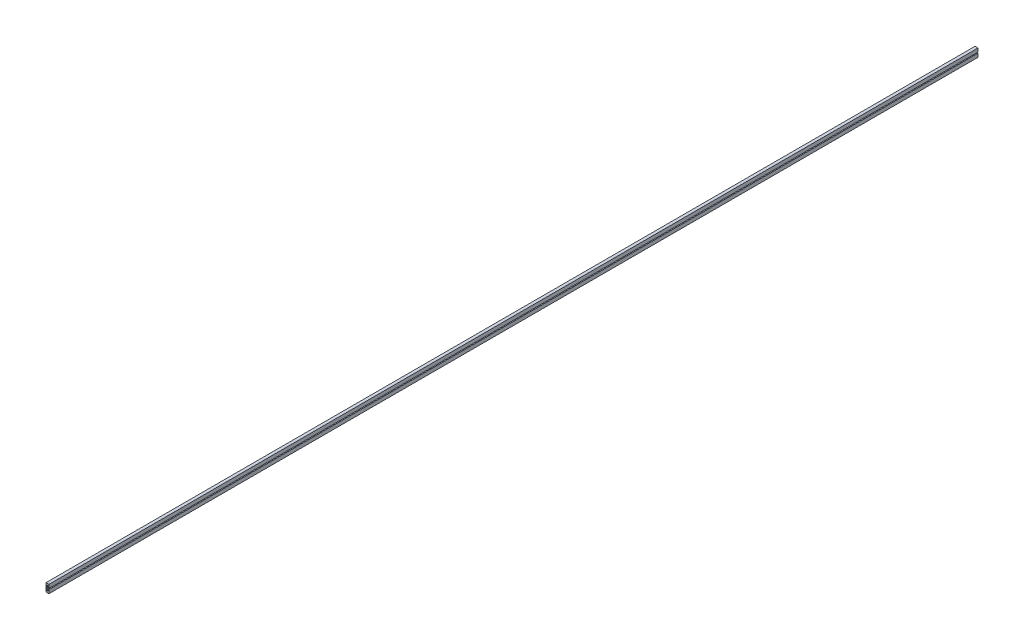
ISO-10303-21;
HEADER;
FILE_DESCRIPTION(('STEP AP214'),'2;1');
FILE_NAME('part.step','',(''),(''),'','','');
FILE_SCHEMA(('AUTOMOTIVE_DESIGN { 1 0 10303 214 1 1 1 1 }'));
ENDSEC;
DATA;
#1=APPLICATION_CONTEXT('core data for automotive mechanical design processes');
#2=APPLICATION_PROTOCOL_DEFINITION('international standard','automotive_design',2000,#1);
#3=PRODUCT_CONTEXT('',#1,'mechanical');
#4=PRODUCT('Part','Part','',(#3));
#5=PRODUCT_RELATED_PRODUCT_CATEGORY('part','',(#4));
#6=PRODUCT_DEFINITION_FORMATION('','',#4);
#7=PRODUCT_DEFINITION_CONTEXT('part definition',#1,'design');
#8=PRODUCT_DEFINITION('design','',#6,#7);
#9=PRODUCT_DEFINITION_SHAPE('','',#8);
#10=(LENGTH_UNIT() NAMED_UNIT(*) SI_UNIT(.MILLI.,.METRE.));
#11=(NAMED_UNIT(*) PLANE_ANGLE_UNIT() SI_UNIT($,.RADIAN.));
#12=(NAMED_UNIT(*) SI_UNIT($,.STERADIAN.) SOLID_ANGLE_UNIT());
#13=UNCERTAINTY_MEASURE_WITH_UNIT(LENGTH_MEASURE(1.E-05),#10,'distance_accuracy_value','');
#14=(GEOMETRIC_REPRESENTATION_CONTEXT(3) GLOBAL_UNCERTAINTY_ASSIGNED_CONTEXT((#13)) GLOBAL_UNIT_ASSIGNED_CONTEXT((#10,
#11,#12)) REPRESENTATION_CONTEXT('',''));
#15=CARTESIAN_POINT('',(0.,0.,0.));
#16=DIRECTION('',(0.,0.,1.));
#17=DIRECTION('',(1.,0.,0.));
#18=AXIS2_PLACEMENT_3D('',#15,#16,#17);
#19=CARTESIAN_POINT('',(0.,6.,2845.));
#20=DIRECTION('',(1.,0.,0.));
#21=DIRECTION('',(0.,1.,0.));
#22=AXIS2_PLACEMENT_3D('',#19,#20,#21);
#23=PLANE('',#22);
#24=DIRECTION('',(0.,-1.,0.));
#25=VECTOR('',#24,1.);
#26=CARTESIAN_POINT('',(0.,6.,0.));
#27=LINE('',#26,#25);
#28=CARTESIAN_POINT('',(0.,6.,0.));
#29=VERTEX_POINT('',#28);
#30=CARTESIAN_POINT('',(0.,0.,0.));
#31=VERTEX_POINT('',#30);
#32=EDGE_CURVE('E164',#29,#31,#27,.T.);
#33=ORIENTED_EDGE('',*,*,#32,.T.);
#34=DIRECTION('',(0.,0.,-1.));
#35=VECTOR('',#34,1.);
#36=CARTESIAN_POINT('',(0.,0.,2845.));
#37=LINE('',#36,#35);
#38=CARTESIAN_POINT('',(0.,0.,2845.));
#39=VERTEX_POINT('',#38);
#40=EDGE_CURVE('E11',#39,#31,#37,.T.);
#41=ORIENTED_EDGE('',*,*,#40,.F.);
#42=DIRECTION('',(0.,-1.,0.));
#43=VECTOR('',#42,1.);
#44=CARTESIAN_POINT('',(0.,6.,2845.));
#45=LINE('',#44,#43);
#46=CARTESIAN_POINT('',(0.,6.,2845.));
#47=VERTEX_POINT('',#46);
#48=EDGE_CURVE('E198',#47,#39,#45,.T.);
#49=ORIENTED_EDGE('',*,*,#48,.F.);
#50=DIRECTION('',(0.,0.,-1.));
#51=VECTOR('',#50,1.);
#52=CARTESIAN_POINT('',(0.,6.,2845.));
#53=LINE('',#52,#51);
#54=EDGE_CURVE('E160',#47,#29,#53,.T.);
#55=ORIENTED_EDGE('',*,*,#54,.T.);
#56=EDGE_LOOP('',(#33,#41,#49,#55));
#57=FACE_BOUND('',#56,.T.);
#58=ADVANCED_FACE('F39',(#57),#23,.F.);
#59=CARTESIAN_POINT('',(0.,0.,2845.));
#60=DIRECTION('',(0.,1.,0.));
#61=DIRECTION('',(0.,0.,1.));
#62=AXIS2_PLACEMENT_3D('',#59,#60,#61);
#63=PLANE('',#62);
#64=DIRECTION('',(1.,0.,0.));
#65=VECTOR('',#64,1.);
#66=CARTESIAN_POINT('',(0.,0.,0.));
#67=LINE('',#66,#65);
#68=CARTESIAN_POINT('',(3.,0.,0.));
#69=VERTEX_POINT('',#68);
#70=EDGE_CURVE('E168',#31,#69,#67,.T.);
#71=ORIENTED_EDGE('',*,*,#70,.T.);
#72=DIRECTION('',(0.,0.,-1.));
#73=VECTOR('',#72,1.);
#74=CARTESIAN_POINT('',(3.,0.,2845.));
#75=LINE('',#74,#73);
#76=CARTESIAN_POINT('',(3.,0.,2845.));
#77=VERTEX_POINT('',#76);
#78=EDGE_CURVE('E48',#77,#69,#75,.T.);
#79=ORIENTED_EDGE('',*,*,#78,.F.);
#80=DIRECTION('',(1.,0.,0.));
#81=VECTOR('',#80,1.);
#82=CARTESIAN_POINT('',(0.,0.,2845.));
#83=LINE('',#82,#81);
#84=EDGE_CURVE('E111',#39,#77,#83,.T.);
#85=ORIENTED_EDGE('',*,*,#84,.F.);
#86=ORIENTED_EDGE('',*,*,#40,.T.);
#87=EDGE_LOOP('',(#71,#79,#85,#86));
#88=FACE_BOUND('',#87,.T.);
#89=ADVANCED_FACE('F292',(#88),#63,.F.);
#90=CARTESIAN_POINT('',(3.,0.,2845.));
#91=DIRECTION('',(-1.,0.,0.));
#92=DIRECTION('',(0.,-1.,0.));
#93=AXIS2_PLACEMENT_3D('',#90,#91,#92);
#94=PLANE('',#93);
#95=DIRECTION('',(0.,1.,0.));
#96=VECTOR('',#95,1.);
#97=CARTESIAN_POINT('',(3.,0.,0.));
#98=LINE('',#97,#96);
#99=CARTESIAN_POINT('',(3.,11.,0.));
#100=VERTEX_POINT('',#99);
#101=EDGE_CURVE('E171',#69,#100,#98,.T.);
#102=ORIENTED_EDGE('',*,*,#101,.T.);
#103=DIRECTION('',(0.,0.,-1.));
#104=VECTOR('',#103,1.);
#105=CARTESIAN_POINT('',(3.,11.,2845.));
#106=LINE('',#105,#104);
#107=CARTESIAN_POINT('',(3.,11.,2845.));
#108=VERTEX_POINT('',#107);
#109=EDGE_CURVE('E225',#108,#100,#106,.T.);
#110=ORIENTED_EDGE('',*,*,#109,.F.);
#111=DIRECTION('',(0.,1.,0.));
#112=VECTOR('',#111,1.);
#113=CARTESIAN_POINT('',(3.,0.,2845.));
#114=LINE('',#113,#112);
#115=EDGE_CURVE('E235',#77,#108,#114,.T.);
#116=ORIENTED_EDGE('',*,*,#115,.F.);
#117=ORIENTED_EDGE('',*,*,#78,.T.);
#118=EDGE_LOOP('',(#102,#110,#116,#117));
#119=FACE_BOUND('',#118,.T.);
#120=ADVANCED_FACE('F233',(#119),#94,.F.);
#121=CARTESIAN_POINT('',(3.,11.,2845.));
#122=DIRECTION('',(0.,-1.,0.));
#123=DIRECTION('',(0.,0.,-1.));
#124=AXIS2_PLACEMENT_3D('',#121,#122,#123);
#125=PLANE('',#124);
#126=DIRECTION('',(-1.,0.,0.));
#127=VECTOR('',#126,1.);
#128=CARTESIAN_POINT('',(3.,11.,0.));
#129=LINE('',#128,#127);
#130=CARTESIAN_POINT('',(-5.99999999999999,11.,0.));
#131=VERTEX_POINT('',#130);
#132=EDGE_CURVE('E174',#100,#131,#129,.T.);
#133=ORIENTED_EDGE('',*,*,#132,.T.);
#134=DIRECTION('',(0.,0.,-1.));
#135=VECTOR('',#134,1.);
#136=CARTESIAN_POINT('',(-5.99999999999999,11.,2845.));
#137=LINE('',#136,#135);
#138=CARTESIAN_POINT('',(-5.99999999999999,11.,2845.));
#139=VERTEX_POINT('',#138);
#140=EDGE_CURVE('E221',#139,#131,#137,.T.);
#141=ORIENTED_EDGE('',*,*,#140,.F.);
#142=DIRECTION('',(-1.,0.,0.));
#143=VECTOR('',#142,1.);
#144=CARTESIAN_POINT('',(3.,11.,2845.));
#145=LINE('',#144,#143);
#146=EDGE_CURVE('E254',#108,#139,#145,.T.);
#147=ORIENTED_EDGE('',*,*,#146,.F.);
#148=ORIENTED_EDGE('',*,*,#109,.T.);
#149=EDGE_LOOP('',(#133,#141,#147,#148));
#150=FACE_BOUND('',#149,.T.);
#151=ADVANCED_FACE('F244',(#150),#125,.F.);
#152=CARTESIAN_POINT('',(-5.99999999999999,11.,2845.));
#153=DIRECTION('',(1.,0.,0.));
#154=DIRECTION('',(0.,0.,-1.));
#155=AXIS2_PLACEMENT_3D('',#152,#153,#154);
#156=PLANE('',#155);
#157=DIRECTION('',(0.,-1.,0.));
#158=VECTOR('',#157,1.);
#159=CARTESIAN_POINT('',(-5.99999999999999,11.,0.));
#160=LINE('',#159,#158);
#161=CARTESIAN_POINT('',(-5.99999999999999,-14.,0.));
#162=VERTEX_POINT('',#161);
#163=EDGE_CURVE('E177',#131,#162,#160,.T.);
#164=ORIENTED_EDGE('',*,*,#163,.T.);
#165=DIRECTION('',(0.,0.,-1.));
#166=VECTOR('',#165,1.);
#167=CARTESIAN_POINT('',(-5.99999999999999,-14.,2845.));
#168=LINE('',#167,#166);
#169=CARTESIAN_POINT('',(-5.99999999999999,-14.,2845.));
#170=VERTEX_POINT('',#169);
#171=EDGE_CURVE('E217',#170,#162,#168,.T.);
#172=ORIENTED_EDGE('',*,*,#171,.F.);
#173=DIRECTION('',(0.,-1.,0.));
#174=VECTOR('',#173,1.);
#175=CARTESIAN_POINT('',(-5.99999999999999,11.,2845.));
#176=LINE('',#175,#174);
#177=EDGE_CURVE('E250',#139,#170,#176,.T.);
#178=ORIENTED_EDGE('',*,*,#177,.F.);
#179=ORIENTED_EDGE('',*,*,#140,.T.);
#180=EDGE_LOOP('',(#164,#172,#178,#179));
#181=FACE_BOUND('',#180,.T.);
#182=ADVANCED_FACE('F248',(#181),#156,.F.);
#183=CARTESIAN_POINT('',(-5.99999999999999,-14.,2845.));
#184=DIRECTION('',(0.,1.,0.));
#185=DIRECTION('',(0.,0.,1.));
#186=AXIS2_PLACEMENT_3D('',#183,#184,#185);
#187=PLANE('',#186);
#188=DIRECTION('',(1.,0.,0.));
#189=VECTOR('',#188,1.);
#190=CARTESIAN_POINT('',(-5.99999999999999,-14.,0.));
#191=LINE('',#190,#189);
#192=CARTESIAN_POINT('',(3.,-14.,0.));
#193=VERTEX_POINT('',#192);
#194=EDGE_CURVE('E180',#162,#193,#191,.T.);
#195=ORIENTED_EDGE('',*,*,#194,.T.);
#196=DIRECTION('',(0.,0.,-1.));
#197=VECTOR('',#196,1.);
#198=CARTESIAN_POINT('',(3.,-14.,2845.));
#199=LINE('',#198,#197);
#200=CARTESIAN_POINT('',(3.,-14.,2845.));
#201=VERTEX_POINT('',#200);
#202=EDGE_CURVE('E213',#201,#193,#199,.T.);
#203=ORIENTED_EDGE('',*,*,#202,.F.);
#204=DIRECTION('',(1.,0.,0.));
#205=VECTOR('',#204,1.);
#206=CARTESIAN_POINT('',(-5.99999999999999,-14.,2845.));
#207=LINE('',#206,#205);
#208=EDGE_CURVE('E253',#170,#201,#207,.T.);
#209=ORIENTED_EDGE('',*,*,#208,.F.);
#210=ORIENTED_EDGE('',*,*,#171,.T.);
#211=EDGE_LOOP('',(#195,#203,#209,#210));
#212=FACE_BOUND('',#211,.T.);
#213=ADVANCED_FACE('F305',(#212),#187,.F.);
#214=CARTESIAN_POINT('',(3.,-14.,2845.));
#215=DIRECTION('',(-1.,0.,0.));
#216=DIRECTION('',(0.,-1.,0.));
#217=AXIS2_PLACEMENT_3D('',#214,#215,#216);
#218=PLANE('',#217);
#219=DIRECTION('',(0.,1.,0.));
#220=VECTOR('',#219,1.);
#221=CARTESIAN_POINT('',(3.,-14.,0.));
#222=LINE('',#221,#220);
#223=CARTESIAN_POINT('',(3.,-3.,0.));
#224=VERTEX_POINT('',#223);
#225=EDGE_CURVE('E183',#193,#224,#222,.T.);
#226=ORIENTED_EDGE('',*,*,#225,.T.);
#227=DIRECTION('',(0.,0.,-1.));
#228=VECTOR('',#227,1.);
#229=CARTESIAN_POINT('',(3.,-3.,2845.));
#230=LINE('',#229,#228);
#231=CARTESIAN_POINT('',(3.,-3.,2845.));
#232=VERTEX_POINT('',#231);
#233=EDGE_CURVE('E209',#232,#224,#230,.T.);
#234=ORIENTED_EDGE('',*,*,#233,.F.);
#235=DIRECTION('',(0.,1.,0.));
#236=VECTOR('',#235,1.);
#237=CARTESIAN_POINT('',(3.,-14.,2845.));
#238=LINE('',#237,#236);
#239=EDGE_CURVE('E258',#201,#232,#238,.T.);
#240=ORIENTED_EDGE('',*,*,#239,.F.);
#241=ORIENTED_EDGE('',*,*,#202,.T.);
#242=EDGE_LOOP('',(#226,#234,#240,#241));
#243=FACE_BOUND('',#242,.T.);
#244=ADVANCED_FACE('F308',(#243),#218,.F.);
#245=CARTESIAN_POINT('',(3.,-3.,2845.));
#246=DIRECTION('',(0.,-1.,0.));
#247=DIRECTION('',(1.,0.,0.));
#248=AXIS2_PLACEMENT_3D('',#245,#246,#247);
#249=PLANE('',#248);
#250=DIRECTION('',(-1.,0.,0.));
#251=VECTOR('',#250,1.);
#252=CARTESIAN_POINT('',(3.,-3.,0.));
#253=LINE('',#252,#251);
#254=CARTESIAN_POINT('',(0.,-3.,0.));
#255=VERTEX_POINT('',#254);
#256=EDGE_CURVE('E186',#224,#255,#253,.T.);
#257=ORIENTED_EDGE('',*,*,#256,.T.);
#258=DIRECTION('',(0.,0.,-1.));
#259=VECTOR('',#258,1.);
#260=CARTESIAN_POINT('',(0.,-3.,2845.));
#261=LINE('',#260,#259);
#262=CARTESIAN_POINT('',(0.,-3.,2845.));
#263=VERTEX_POINT('',#262);
#264=EDGE_CURVE('E205',#263,#255,#261,.T.);
#265=ORIENTED_EDGE('',*,*,#264,.F.);
#266=DIRECTION('',(-1.,0.,0.));
#267=VECTOR('',#266,1.);
#268=CARTESIAN_POINT('',(3.,-3.,2845.));
#269=LINE('',#268,#267);
#270=EDGE_CURVE('E265',#232,#263,#269,.T.);
#271=ORIENTED_EDGE('',*,*,#270,.F.);
#272=ORIENTED_EDGE('',*,*,#233,.T.);
#273=EDGE_LOOP('',(#257,#265,#271,#272));
#274=FACE_BOUND('',#273,.T.);
#275=ADVANCED_FACE('F273',(#274),#249,.F.);
#276=CARTESIAN_POINT('',(0.,-3.,2845.));
#277=DIRECTION('',(1.,0.,0.));
#278=DIRECTION('',(0.,1.,0.));
#279=AXIS2_PLACEMENT_3D('',#276,#277,#278);
#280=PLANE('',#279);
#281=DIRECTION('',(0.,-1.,0.));
#282=VECTOR('',#281,1.);
#283=CARTESIAN_POINT('',(0.,-3.,0.));
#284=LINE('',#283,#282);
#285=CARTESIAN_POINT('',(0.,-9.,0.));
#286=VERTEX_POINT('',#285);
#287=EDGE_CURVE('E189',#255,#286,#284,.T.);
#288=ORIENTED_EDGE('',*,*,#287,.T.);
#289=DIRECTION('',(0.,0.,-1.));
#290=VECTOR('',#289,1.);
#291=CARTESIAN_POINT('',(0.,-9.,2845.));
#292=LINE('',#291,#290);
#293=CARTESIAN_POINT('',(0.,-9.,2845.));
#294=VERTEX_POINT('',#293);
#295=EDGE_CURVE('E153',#294,#286,#292,.T.);
#296=ORIENTED_EDGE('',*,*,#295,.F.);
#297=DIRECTION('',(0.,-1.,0.));
#298=VECTOR('',#297,1.);
#299=CARTESIAN_POINT('',(0.,-3.,2845.));
#300=LINE('',#299,#298);
#301=EDGE_CURVE('E142',#263,#294,#300,.T.);
#302=ORIENTED_EDGE('',*,*,#301,.F.);
#303=ORIENTED_EDGE('',*,*,#264,.T.);
#304=EDGE_LOOP('',(#288,#296,#302,#303));
#305=FACE_BOUND('',#304,.T.);
#306=ADVANCED_FACE('F277',(#305),#280,.F.);
#307=CARTESIAN_POINT('',(0.,-9.,2845.));
#308=DIRECTION('',(0.,-1.,0.));
#309=DIRECTION('',(1.,0.,0.));
#310=AXIS2_PLACEMENT_3D('',#307,#308,#309);
#311=PLANE('',#310);
#312=DIRECTION('',(-1.,0.,0.));
#313=VECTOR('',#312,1.);
#314=CARTESIAN_POINT('',(0.,-9.,0.));
#315=LINE('',#314,#313);
#316=CARTESIAN_POINT('',(-3.,-9.,0.));
#317=VERTEX_POINT('',#316);
#318=EDGE_CURVE('E151',#286,#317,#315,.T.);
#319=ORIENTED_EDGE('',*,*,#318,.T.);
#320=DIRECTION('',(0.,0.,-1.));
#321=VECTOR('',#320,1.);
#322=CARTESIAN_POINT('',(-3.,-9.,2845.));
#323=LINE('',#322,#321);
#324=CARTESIAN_POINT('',(-3.,-9.,2845.));
#325=VERTEX_POINT('',#324);
#326=EDGE_CURVE('E148',#325,#317,#323,.T.);
#327=ORIENTED_EDGE('',*,*,#326,.F.);
#328=DIRECTION('',(-1.,0.,0.));
#329=VECTOR('',#328,1.);
#330=CARTESIAN_POINT('',(0.,-9.,2845.));
#331=LINE('',#330,#329);
#332=EDGE_CURVE('E136',#294,#325,#331,.T.);
#333=ORIENTED_EDGE('',*,*,#332,.F.);
#334=ORIENTED_EDGE('',*,*,#295,.T.);
#335=EDGE_LOOP('',(#319,#327,#333,#334));
#336=FACE_BOUND('',#335,.T.);
#337=ADVANCED_FACE('F149',(#336),#311,.F.);
#338=CARTESIAN_POINT('',(-3.,-9.,2845.));
#339=DIRECTION('',(-1.,0.,0.));
#340=DIRECTION('',(0.,-1.,0.));
#341=AXIS2_PLACEMENT_3D('',#338,#339,#340);
#342=PLANE('',#341);
#343=DIRECTION('',(0.,1.,0.));
#344=VECTOR('',#343,1.);
#345=CARTESIAN_POINT('',(-3.,-9.,0.));
#346=LINE('',#345,#344);
#347=CARTESIAN_POINT('',(-3.,6.,0.));
#348=VERTEX_POINT('',#347);
#349=EDGE_CURVE('E97',#317,#348,#346,.T.);
#350=ORIENTED_EDGE('',*,*,#349,.T.);
#351=DIRECTION('',(0.,0.,-1.));
#352=VECTOR('',#351,1.);
#353=CARTESIAN_POINT('',(-3.,6.,2845.));
#354=LINE('',#353,#352);
#355=CARTESIAN_POINT('',(-3.,6.,2845.));
#356=VERTEX_POINT('',#355);
#357=EDGE_CURVE('E154',#356,#348,#354,.T.);
#358=ORIENTED_EDGE('',*,*,#357,.F.);
#359=DIRECTION('',(0.,1.,0.));
#360=VECTOR('',#359,1.);
#361=CARTESIAN_POINT('',(-3.,-9.,2845.));
#362=LINE('',#361,#360);
#363=EDGE_CURVE('E140',#325,#356,#362,.T.);
#364=ORIENTED_EDGE('',*,*,#363,.F.);
#365=ORIENTED_EDGE('',*,*,#326,.T.);
#366=EDGE_LOOP('',(#350,#358,#364,#365));
#367=FACE_BOUND('',#366,.T.);
#368=ADVANCED_FACE('F156',(#367),#342,.F.);
#369=CARTESIAN_POINT('',(-3.,6.,2845.));
#370=DIRECTION('',(0.,1.,0.));
#371=DIRECTION('',(-1.,0.,0.));
#372=AXIS2_PLACEMENT_3D('',#369,#370,#371);
#373=PLANE('',#372);
#374=DIRECTION('',(1.,0.,0.));
#375=VECTOR('',#374,1.);
#376=CARTESIAN_POINT('',(-3.,6.,0.));
#377=LINE('',#376,#375);
#378=EDGE_CURVE('E103',#348,#29,#377,.T.);
#379=ORIENTED_EDGE('',*,*,#378,.T.);
#380=ORIENTED_EDGE('',*,*,#54,.F.);
#381=DIRECTION('',(1.,0.,0.));
#382=VECTOR('',#381,1.);
#383=CARTESIAN_POINT('',(-3.,6.,2845.));
#384=LINE('',#383,#382);
#385=EDGE_CURVE('E56',#356,#47,#384,.T.);
#386=ORIENTED_EDGE('',*,*,#385,.F.);
#387=ORIENTED_EDGE('',*,*,#357,.T.);
#388=EDGE_LOOP('',(#379,#380,#386,#387));
#389=FACE_BOUND('',#388,.T.);
#390=ADVANCED_FACE('F281',(#389),#373,.F.);
#391=CARTESIAN_POINT('',(0.,0.,2845.));
#392=DIRECTION('',(0.,0.,1.));
#393=DIRECTION('',(1.,0.,0.));
#394=AXIS2_PLACEMENT_3D('',#391,#392,#393);
#395=PLANE('',#394);
#396=ORIENTED_EDGE('',*,*,#48,.T.);
#397=ORIENTED_EDGE('',*,*,#84,.T.);
#398=ORIENTED_EDGE('',*,*,#115,.T.);
#399=ORIENTED_EDGE('',*,*,#146,.T.);
#400=ORIENTED_EDGE('',*,*,#177,.T.);
#401=ORIENTED_EDGE('',*,*,#208,.T.);
#402=ORIENTED_EDGE('',*,*,#239,.T.);
#403=ORIENTED_EDGE('',*,*,#270,.T.);
#404=ORIENTED_EDGE('',*,*,#301,.T.);
#405=ORIENTED_EDGE('',*,*,#332,.T.);
#406=ORIENTED_EDGE('',*,*,#363,.T.);
#407=ORIENTED_EDGE('',*,*,#385,.T.);
#408=EDGE_LOOP('',(#396,#397,#398,#399,#400,#401,#402,#403,#404,#405,#406,#407));
#409=FACE_BOUND('',#408,.T.);
#410=ADVANCED_FACE('F138',(#409),#395,.T.);
#411=CARTESIAN_POINT('',(0.,0.,0.));
#412=DIRECTION('',(0.,0.,1.));
#413=DIRECTION('',(1.,0.,0.));
#414=AXIS2_PLACEMENT_3D('',#411,#412,#413);
#415=PLANE('',#414);
#416=ORIENTED_EDGE('',*,*,#32,.F.);
#417=ORIENTED_EDGE('',*,*,#378,.F.);
#418=ORIENTED_EDGE('',*,*,#349,.F.);
#419=ORIENTED_EDGE('',*,*,#318,.F.);
#420=ORIENTED_EDGE('',*,*,#287,.F.);
#421=ORIENTED_EDGE('',*,*,#256,.F.);
#422=ORIENTED_EDGE('',*,*,#225,.F.);
#423=ORIENTED_EDGE('',*,*,#194,.F.);
#424=ORIENTED_EDGE('',*,*,#163,.F.);
#425=ORIENTED_EDGE('',*,*,#132,.F.);
#426=ORIENTED_EDGE('',*,*,#101,.F.);
#427=ORIENTED_EDGE('',*,*,#70,.F.);
#428=EDGE_LOOP('',(#416,#417,#418,#419,#420,#421,#422,#423,#424,#425,#426,#427));
#429=FACE_BOUND('',#428,.T.);
#430=ADVANCED_FACE('F239',(#429),#415,.F.);
#431=CLOSED_SHELL('',(#58,#89,#120,#151,#182,#213,#244,#275,#306,#337,#368,#390,#410,#430));
#432=MANIFOLD_SOLID_BREP('B2',#431);
#433=ADVANCED_BREP_SHAPE_REPRESENTATION('',(#18,#432),#14);
#434=SHAPE_DEFINITION_REPRESENTATION(#9,#433);
ENDSEC;
END-ISO-10303-21;
